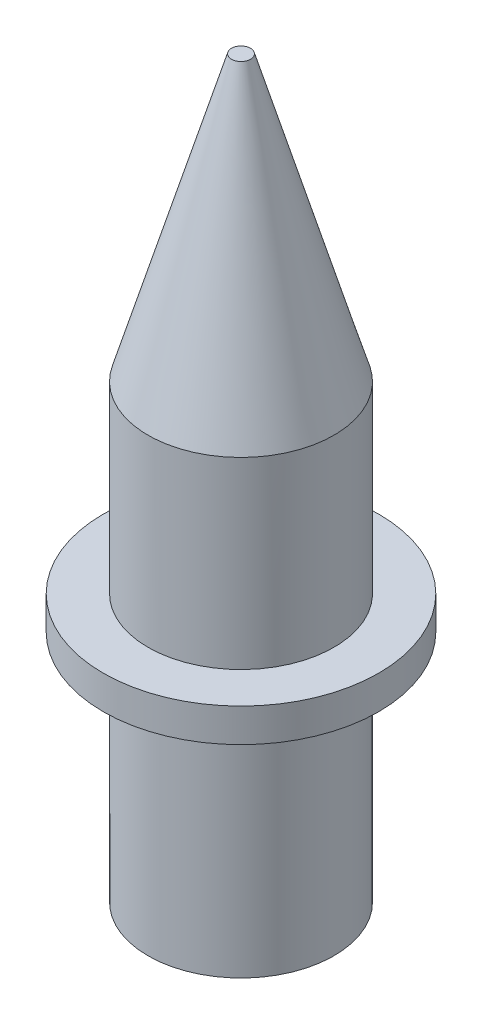
ISO-10303-21;
HEADER;
FILE_DESCRIPTION(('STEP AP214'),'2;1');
FILE_NAME('part.step','',(''),(''),'','','');
FILE_SCHEMA(('AUTOMOTIVE_DESIGN { 1 0 10303 214 1 1 1 1 }'));
ENDSEC;
DATA;
#1=APPLICATION_CONTEXT('core data for automotive mechanical design processes');
#2=APPLICATION_PROTOCOL_DEFINITION('international standard','automotive_design',2000,#1);
#3=PRODUCT_CONTEXT('',#1,'mechanical');
#4=PRODUCT('Part','Part','',(#3));
#5=PRODUCT_RELATED_PRODUCT_CATEGORY('part','',(#4));
#6=PRODUCT_DEFINITION_FORMATION('','',#4);
#7=PRODUCT_DEFINITION_CONTEXT('part definition',#1,'design');
#8=PRODUCT_DEFINITION('design','',#6,#7);
#9=PRODUCT_DEFINITION_SHAPE('','',#8);
#10=(LENGTH_UNIT() NAMED_UNIT(*) SI_UNIT(.MILLI.,.METRE.));
#11=(NAMED_UNIT(*) PLANE_ANGLE_UNIT() SI_UNIT($,.RADIAN.));
#12=(NAMED_UNIT(*) SI_UNIT($,.STERADIAN.) SOLID_ANGLE_UNIT());
#13=UNCERTAINTY_MEASURE_WITH_UNIT(LENGTH_MEASURE(1.E-05),#10,'distance_accuracy_value','');
#14=(GEOMETRIC_REPRESENTATION_CONTEXT(3) GLOBAL_UNCERTAINTY_ASSIGNED_CONTEXT((#13)) GLOBAL_UNIT_ASSIGNED_CONTEXT((#10,
#11,#12)) REPRESENTATION_CONTEXT('',''));
#15=CARTESIAN_POINT('',(0.,0.,0.));
#16=DIRECTION('',(0.,0.,1.));
#17=DIRECTION('',(1.,0.,0.));
#18=AXIS2_PLACEMENT_3D('',#15,#16,#17);
#19=CARTESIAN_POINT('',(0.,44.,0.));
#20=DIRECTION('',(0.,-1.,0.));
#21=DIRECTION('',(0.,0.,-1.));
#22=AXIS2_PLACEMENT_3D('',#19,#20,#21);
#23=CYLINDRICAL_SURFACE('',#22,5.57);
#24=CARTESIAN_POINT('',(0.,16.,0.));
#25=DIRECTION('',(0.,1.,0.));
#26=DIRECTION('',(0.,0.,1.));
#27=AXIS2_PLACEMENT_3D('',#24,#25,#26);
#28=CIRCLE('',#27,5.57);
#29=CARTESIAN_POINT('',(0.,16.,5.57));
#30=VERTEX_POINT('',#29);
#31=EDGE_CURVE('E50',#30,#30,#28,.T.);
#32=ORIENTED_EDGE('',*,*,#31,.T.);
#33=EDGE_LOOP('',(#32));
#34=FACE_BOUND('',#33,.T.);
#35=CARTESIAN_POINT('',(0.,26.9999999999998,0.));
#36=DIRECTION('',(0.,1.,0.));
#37=DIRECTION('',(0.,0.,1.));
#38=AXIS2_PLACEMENT_3D('',#35,#36,#37);
#39=CIRCLE('',#38,5.57);
#40=CARTESIAN_POINT('',(0.,26.9999999999998,-5.57));
#41=VERTEX_POINT('',#40);
#42=EDGE_CURVE('E38',#41,#41,#39,.F.);
#43=ORIENTED_EDGE('',*,*,#42,.T.);
#44=EDGE_LOOP('',(#43));
#45=FACE_BOUND('',#44,.T.);
#46=ADVANCED_FACE('F31',(#34,#45),#23,.T.);
#47=CARTESIAN_POINT('',(0.,44.,0.));
#48=DIRECTION('',(0.,1.,0.));
#49=DIRECTION('',(0.,0.,1.));
#50=AXIS2_PLACEMENT_3D('',#47,#48,#49);
#51=PLANE('',#50);
#52=CARTESIAN_POINT('',(0.,44.,0.));
#53=DIRECTION('',(0.,1.,0.));
#54=DIRECTION('',(0.,0.,1.));
#55=AXIS2_PLACEMENT_3D('',#52,#53,#54);
#56=CIRCLE('',#55,0.570000000000001);
#57=CARTESIAN_POINT('',(0.,44.,-0.570000000000002));
#58=VERTEX_POINT('',#57);
#59=EDGE_CURVE('E42',#58,#58,#56,.T.);
#60=ORIENTED_EDGE('',*,*,#59,.T.);
#61=EDGE_LOOP('',(#60));
#62=FACE_BOUND('',#61,.T.);
#63=ADVANCED_FACE('F83',(#62),#51,.T.);
#64=CARTESIAN_POINT('',(0.,44.,0.));
#65=DIRECTION('',(0.,-1.,0.));
#66=DIRECTION('',(0.,0.,-1.));
#67=AXIS2_PLACEMENT_3D('',#64,#65,#66);
#68=CONICAL_SURFACE('',#67,0.570000000000001,0.286051441717315);
#69=CARTESIAN_POINT('',(0.,26.9999999999998,-5.57));
#70=CARTESIAN_POINT('',(0.,27.1770833333332,-5.51791666666667));
#71=CARTESIAN_POINT('',(0.,27.3541666666665,-5.46583333333333));
#72=CARTESIAN_POINT('',(0.,27.7083333333332,-5.36166666666667));
#73=CARTESIAN_POINT('',(0.,27.8854166666665,-5.30958333333333));
#74=CARTESIAN_POINT('',(0.,28.2395833333332,-5.20541666666667));
#75=CARTESIAN_POINT('',(0.,28.4166666666665,-5.15333333333333));
#76=CARTESIAN_POINT('',(0.,28.7708333333332,-5.04916666666667));
#77=CARTESIAN_POINT('',(0.,28.9479166666665,-4.99708333333333));
#78=CARTESIAN_POINT('',(0.,29.3020833333332,-4.89291666666667));
#79=CARTESIAN_POINT('',(0.,29.4791666666665,-4.84083333333333));
#80=CARTESIAN_POINT('',(0.,29.8333333333332,-4.73666666666667));
#81=CARTESIAN_POINT('',(0.,30.0104166666665,-4.68458333333333));
#82=CARTESIAN_POINT('',(0.,30.3645833333332,-4.58041666666667));
#83=CARTESIAN_POINT('',(0.,30.5416666666665,-4.52833333333333));
#84=CARTESIAN_POINT('',(0.,30.8958333333332,-4.42416666666667));
#85=CARTESIAN_POINT('',(0.,31.0729166666665,-4.37208333333333));
#86=CARTESIAN_POINT('',(0.,31.4270833333332,-4.26791666666667));
#87=CARTESIAN_POINT('',(0.,31.6041666666665,-4.21583333333333));
#88=CARTESIAN_POINT('',(0.,31.9583333333332,-4.11166666666667));
#89=CARTESIAN_POINT('',(0.,32.1354166666665,-4.05958333333333));
#90=CARTESIAN_POINT('',(0.,32.4895833333332,-3.95541666666667));
#91=CARTESIAN_POINT('',(0.,32.6666666666665,-3.90333333333333));
#92=CARTESIAN_POINT('',(0.,33.0208333333332,-3.79916666666667));
#93=CARTESIAN_POINT('',(0.,33.1979166666666,-3.74708333333333));
#94=CARTESIAN_POINT('',(0.,33.5520833333332,-3.64291666666667));
#95=CARTESIAN_POINT('',(0.,33.7291666666666,-3.59083333333333));
#96=CARTESIAN_POINT('',(0.,34.0833333333332,-3.48666666666667));
#97=CARTESIAN_POINT('',(0.,34.2604166666666,-3.43458333333333));
#98=CARTESIAN_POINT('',(0.,34.6145833333332,-3.33041666666667));
#99=CARTESIAN_POINT('',(0.,34.7916666666666,-3.27833333333333));
#100=CARTESIAN_POINT('',(0.,35.1458333333332,-3.17416666666667));
#101=CARTESIAN_POINT('',(0.,35.3229166666666,-3.12208333333333));
#102=CARTESIAN_POINT('',(0.,35.6770833333332,-3.01791666666667));
#103=CARTESIAN_POINT('',(0.,35.8541666666666,-2.96583333333333));
#104=CARTESIAN_POINT('',(0.,36.2083333333332,-2.86166666666667));
#105=CARTESIAN_POINT('',(0.,36.3854166666666,-2.80958333333333));
#106=CARTESIAN_POINT('',(0.,36.7395833333333,-2.70541666666667));
#107=CARTESIAN_POINT('',(0.,36.9166666666666,-2.65333333333333));
#108=CARTESIAN_POINT('',(0.,37.2708333333333,-2.54916666666667));
#109=CARTESIAN_POINT('',(0.,37.4479166666666,-2.49708333333333));
#110=CARTESIAN_POINT('',(0.,37.8020833333333,-2.39291666666667));
#111=CARTESIAN_POINT('',(0.,37.9791666666666,-2.34083333333333));
#112=CARTESIAN_POINT('',(0.,38.3333333333333,-2.23666666666667));
#113=CARTESIAN_POINT('',(0.,38.5104166666666,-2.18458333333333));
#114=CARTESIAN_POINT('',(0.,38.8645833333333,-2.08041666666667));
#115=CARTESIAN_POINT('',(0.,39.0416666666666,-2.02833333333333));
#116=CARTESIAN_POINT('',(0.,39.3958333333333,-1.92416666666667));
#117=CARTESIAN_POINT('',(0.,39.5729166666666,-1.87208333333333));
#118=CARTESIAN_POINT('',(0.,39.9270833333333,-1.76791666666667));
#119=CARTESIAN_POINT('',(0.,40.1041666666666,-1.71583333333334));
#120=CARTESIAN_POINT('',(0.,40.4583333333333,-1.61166666666667));
#121=CARTESIAN_POINT('',(0.,40.6354166666666,-1.55958333333333));
#122=CARTESIAN_POINT('',(0.,40.9895833333333,-1.45541666666667));
#123=CARTESIAN_POINT('',(0.,41.1666666666666,-1.40333333333334));
#124=CARTESIAN_POINT('',(0.,41.5208333333333,-1.29916666666667));
#125=CARTESIAN_POINT('',(0.,41.6979166666666,-1.24708333333333));
#126=CARTESIAN_POINT('',(0.,42.0520833333333,-1.14291666666667));
#127=CARTESIAN_POINT('',(0.,42.2291666666666,-1.09083333333334));
#128=CARTESIAN_POINT('',(0.,42.5833333333333,-0.986666666666669));
#129=CARTESIAN_POINT('',(0.,42.7604166666667,-0.934583333333336));
#130=CARTESIAN_POINT('',(0.,43.1145833333333,-0.830416666666668));
#131=CARTESIAN_POINT('',(0.,43.2916666666667,-0.778333333333335));
#132=CARTESIAN_POINT('',(0.,43.6458333333333,-0.674166666666668));
#133=CARTESIAN_POINT('',(0.,43.8229166666667,-0.622083333333334));
#134=CARTESIAN_POINT('',(0.,44.,-0.570000000000002));
#135=B_SPLINE_CURVE_WITH_KNOTS('',3,(#69,#70,#71,#72,#73,#74,#75,#76,#77,#78,#79,#80,#81,#82,
#83,#84,#85,#86,#87,#88,#89,#90,#91,#92,#93,#94,#95,#96,#97,#98,#99,#100,#101,#102,#103,#104,
#105,#106,#107,#108,#109,#110,#111,#112,#113,#114,#115,#116,#117,#118,#119,#120,#121,#122,#123,
#124,#125,#126,#127,#128,#129,#130,#131,#132,#133,#134),.UNSPECIFIED.,.F.,.F.,(4,2,2,2,2,2,2,2,
2,2,2,2,2,2,2,2,2,2,2,2,2,2,2,2,2,2,2,2,2,2,2,2,4),(0.,0.553751410833421,1.10750282166684,
1.66125423250027,2.21500564333369,2.76875705416711,3.32250846500054,3.87625987583396,
4.43001128666738,4.9837626975008,5.53751410833422,6.09126551916765,6.64501693000107,
7.19876834083449,7.75251975166791,8.30627116250134,8.86002257333476,9.41377398416818,
9.9675253950016,10.521276805835,11.0750282166685,11.6287796275019,12.1825310383353,
12.7362824491687,13.2900338600021,13.8437852708356,14.397536681669,14.9512880925024,
15.5050395033358,16.0587909141693,16.6125423250027,17.1662937358361,17.7200451466695),.UNSPECIFIED.);
#136=EDGE_CURVE('BSEAM33',#41,#58,#135,.T.);
#137=ORIENTED_EDGE('',*,*,#42,.F.);
#138=ORIENTED_EDGE('',*,*,#59,.F.);
#139=ORIENTED_EDGE('',*,*,#136,.T.);
#140=ORIENTED_EDGE('',*,*,#136,.F.);
#141=EDGE_LOOP('',(#137,#139,#138,#140));
#142=FACE_BOUND('',#141,.T.);
#143=ADVANCED_FACE('F33',(#142),#68,.T.);
#144=CARTESIAN_POINT('',(0.,14.,0.));
#145=DIRECTION('',(0.,1.,0.));
#146=DIRECTION('',(0.,0.,1.));
#147=AXIS2_PLACEMENT_3D('',#144,#145,#146);
#148=PLANE('',#147);
#149=CARTESIAN_POINT('',(0.,14.,0.));
#150=DIRECTION('',(0.,1.,0.));
#151=DIRECTION('',(0.,0.,1.));
#152=AXIS2_PLACEMENT_3D('',#149,#150,#151);
#153=CIRCLE('',#152,8.25);
#154=CARTESIAN_POINT('',(0.,14.,8.25));
#155=VERTEX_POINT('',#154);
#156=EDGE_CURVE('E52',#155,#155,#153,.T.);
#157=ORIENTED_EDGE('',*,*,#156,.F.);
#158=EDGE_LOOP('',(#157));
#159=FACE_BOUND('',#158,.T.);
#160=CARTESIAN_POINT('',(0.,14.,0.));
#161=DIRECTION('',(0.,1.,0.));
#162=DIRECTION('',(0.,0.,1.));
#163=AXIS2_PLACEMENT_3D('',#160,#161,#162);
#164=CIRCLE('',#163,5.57);
#165=CARTESIAN_POINT('',(0.,14.,5.57));
#166=VERTEX_POINT('',#165);
#167=EDGE_CURVE('E10',#166,#166,#164,.T.);
#168=ORIENTED_EDGE('',*,*,#167,.T.);
#169=EDGE_LOOP('',(#168));
#170=FACE_BOUND('',#169,.T.);
#171=ADVANCED_FACE('F79',(#159,#170),#148,.F.);
#172=CARTESIAN_POINT('',(0.,16.,0.));
#173=DIRECTION('',(0.,1.,0.));
#174=DIRECTION('',(0.,0.,1.));
#175=AXIS2_PLACEMENT_3D('',#172,#173,#174);
#176=PLANE('',#175);
#177=CARTESIAN_POINT('',(0.,16.,0.));
#178=DIRECTION('',(0.,1.,0.));
#179=DIRECTION('',(0.,0.,1.));
#180=AXIS2_PLACEMENT_3D('',#177,#178,#179);
#181=CIRCLE('',#180,8.25);
#182=CARTESIAN_POINT('',(0.,16.,8.25));
#183=VERTEX_POINT('',#182);
#184=EDGE_CURVE('E57',#183,#183,#181,.T.);
#185=ORIENTED_EDGE('',*,*,#184,.T.);
#186=EDGE_LOOP('',(#185));
#187=FACE_BOUND('',#186,.T.);
#188=ORIENTED_EDGE('',*,*,#31,.F.);
#189=EDGE_LOOP('',(#188));
#190=FACE_BOUND('',#189,.T.);
#191=ADVANCED_FACE('F65',(#187,#190),#176,.T.);
#192=CARTESIAN_POINT('',(0.,14.,0.));
#193=DIRECTION('',(0.,1.,0.));
#194=DIRECTION('',(0.,0.,1.));
#195=AXIS2_PLACEMENT_3D('',#192,#193,#194);
#196=CYLINDRICAL_SURFACE('',#195,8.25);
#197=ORIENTED_EDGE('',*,*,#156,.T.);
#198=EDGE_LOOP('',(#197));
#199=FACE_BOUND('',#198,.T.);
#200=ORIENTED_EDGE('',*,*,#184,.F.);
#201=EDGE_LOOP('',(#200));
#202=FACE_BOUND('',#201,.T.);
#203=ADVANCED_FACE('F68',(#199,#202),#196,.T.);
#204=CARTESIAN_POINT('',(0.,0.,0.));
#205=DIRECTION('',(0.,1.,0.));
#206=DIRECTION('',(0.,0.,1.));
#207=AXIS2_PLACEMENT_3D('',#204,#205,#206);
#208=PLANE('',#207);
#209=CARTESIAN_POINT('',(0.,0.,0.));
#210=DIRECTION('',(0.,1.,0.));
#211=DIRECTION('',(0.,0.,1.));
#212=AXIS2_PLACEMENT_3D('',#209,#210,#211);
#213=CIRCLE('',#212,5.57);
#214=CARTESIAN_POINT('',(0.,0.,5.57));
#215=VERTEX_POINT('',#214);
#216=EDGE_CURVE('E47',#215,#215,#213,.T.);
#217=ORIENTED_EDGE('',*,*,#216,.F.);
#218=EDGE_LOOP('',(#217));
#219=FACE_BOUND('',#218,.T.);
#220=ADVANCED_FACE('F70',(#219),#208,.F.);
#221=ORIENTED_EDGE('',*,*,#216,.T.);
#222=EDGE_LOOP('',(#221));
#223=FACE_BOUND('',#222,.T.);
#224=ORIENTED_EDGE('',*,*,#167,.F.);
#225=EDGE_LOOP('',(#224));
#226=FACE_BOUND('',#225,.T.);
#227=ADVANCED_FACE('F76',(#223,#226),#23,.T.);
#228=CLOSED_SHELL('',(#46,#63,#143,#171,#191,#203,#220,#227));
#229=MANIFOLD_SOLID_BREP('B2',#228);
#230=ADVANCED_BREP_SHAPE_REPRESENTATION('',(#18,#229),#14);
#231=SHAPE_DEFINITION_REPRESENTATION(#9,#230);
ENDSEC;
END-ISO-10303-21;
